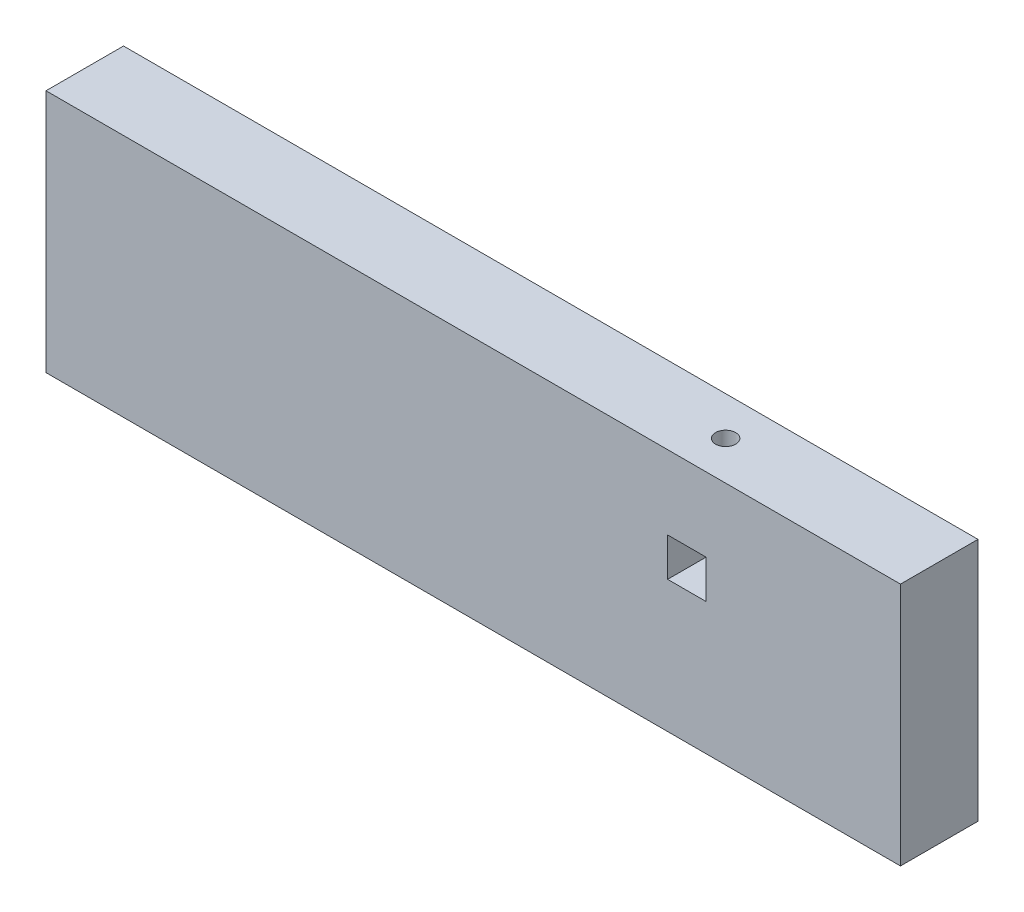
ISO-10303-21;
HEADER;
FILE_DESCRIPTION(('STEP AP214'),'2;1');
FILE_NAME('part.step','',(''),(''),'','','');
FILE_SCHEMA(('AUTOMOTIVE_DESIGN { 1 0 10303 214 1 1 1 1 }'));
ENDSEC;
DATA;
#1=APPLICATION_CONTEXT('core data for automotive mechanical design processes');
#2=APPLICATION_PROTOCOL_DEFINITION('international standard','automotive_design',2000,#1);
#3=PRODUCT_CONTEXT('',#1,'mechanical');
#4=PRODUCT('Part','Part','',(#3));
#5=PRODUCT_RELATED_PRODUCT_CATEGORY('part','',(#4));
#6=PRODUCT_DEFINITION_FORMATION('','',#4);
#7=PRODUCT_DEFINITION_CONTEXT('part definition',#1,'design');
#8=PRODUCT_DEFINITION('design','',#6,#7);
#9=PRODUCT_DEFINITION_SHAPE('','',#8);
#10=(LENGTH_UNIT() NAMED_UNIT(*) SI_UNIT(.MILLI.,.METRE.));
#11=(NAMED_UNIT(*) PLANE_ANGLE_UNIT() SI_UNIT($,.RADIAN.));
#12=(NAMED_UNIT(*) SI_UNIT($,.STERADIAN.) SOLID_ANGLE_UNIT());
#13=UNCERTAINTY_MEASURE_WITH_UNIT(LENGTH_MEASURE(1.E-05),#10,'distance_accuracy_value','');
#14=(GEOMETRIC_REPRESENTATION_CONTEXT(3) GLOBAL_UNCERTAINTY_ASSIGNED_CONTEXT((#13)) GLOBAL_UNIT_ASSIGNED_CONTEXT((#10,
#11,#12)) REPRESENTATION_CONTEXT('',''));
#15=CARTESIAN_POINT('',(0.,0.,0.));
#16=DIRECTION('',(0.,0.,1.));
#17=DIRECTION('',(1.,0.,0.));
#18=AXIS2_PLACEMENT_3D('',#15,#16,#17);
#19=CARTESIAN_POINT('',(0.,0.,12.7));
#20=DIRECTION('',(0.,0.,1.));
#21=DIRECTION('',(1.,0.,0.));
#22=AXIS2_PLACEMENT_3D('',#19,#20,#21);
#23=PLANE('',#22);
#24=DIRECTION('',(0.,-1.,0.));
#25=VECTOR('',#24,1.);
#26=CARTESIAN_POINT('',(-70.,40.,12.7));
#27=LINE('',#26,#25);
#28=CARTESIAN_POINT('',(-70.,40.,12.7));
#29=VERTEX_POINT('',#28);
#30=CARTESIAN_POINT('',(-70.,0.,12.7));
#31=VERTEX_POINT('',#30);
#32=EDGE_CURVE('E169',#29,#31,#27,.T.);
#33=ORIENTED_EDGE('',*,*,#32,.T.);
#34=DIRECTION('',(1.,0.,0.));
#35=VECTOR('',#34,1.);
#36=CARTESIAN_POINT('',(-70.,0.,12.7));
#37=LINE('',#36,#35);
#38=CARTESIAN_POINT('',(70.,0.,12.7));
#39=VERTEX_POINT('',#38);
#40=EDGE_CURVE('E172',#31,#39,#37,.T.);
#41=ORIENTED_EDGE('',*,*,#40,.T.);
#42=DIRECTION('',(0.,1.,0.));
#43=VECTOR('',#42,1.);
#44=CARTESIAN_POINT('',(70.,40.,12.7));
#45=LINE('',#44,#43);
#46=CARTESIAN_POINT('',(70.,40.,12.7));
#47=VERTEX_POINT('',#46);
#48=EDGE_CURVE('E175',#39,#47,#45,.T.);
#49=ORIENTED_EDGE('',*,*,#48,.T.);
#50=DIRECTION('',(-1.,0.,0.));
#51=VECTOR('',#50,1.);
#52=CARTESIAN_POINT('',(-70.,40.,12.7));
#53=LINE('',#52,#51);
#54=EDGE_CURVE('E177',#47,#29,#53,.T.);
#55=ORIENTED_EDGE('',*,*,#54,.T.);
#56=EDGE_LOOP('',(#33,#41,#49,#55));
#57=FACE_BOUND('',#56,.T.);
#58=DIRECTION('',(1.,0.,0.));
#59=VECTOR('',#58,1.);
#60=CARTESIAN_POINT('',(31.85,21.6,12.7));
#61=LINE('',#60,#59);
#62=CARTESIAN_POINT('',(31.85,21.6,12.7));
#63=VERTEX_POINT('',#62);
#64=CARTESIAN_POINT('',(38.15,21.6,12.7));
#65=VERTEX_POINT('',#64);
#66=EDGE_CURVE('E145',#63,#65,#61,.T.);
#67=ORIENTED_EDGE('',*,*,#66,.F.);
#68=DIRECTION('',(0.,-1.,0.));
#69=VECTOR('',#68,1.);
#70=CARTESIAN_POINT('',(31.85,27.9,12.7));
#71=LINE('',#70,#69);
#72=CARTESIAN_POINT('',(31.85,27.9,12.7));
#73=VERTEX_POINT('',#72);
#74=EDGE_CURVE('E143',#73,#63,#71,.T.);
#75=ORIENTED_EDGE('',*,*,#74,.F.);
#76=DIRECTION('',(-1.,0.,0.));
#77=VECTOR('',#76,1.);
#78=CARTESIAN_POINT('',(31.85,27.9,12.7));
#79=LINE('',#78,#77);
#80=CARTESIAN_POINT('',(38.15,27.9,12.7));
#81=VERTEX_POINT('',#80);
#82=EDGE_CURVE('E150',#81,#73,#79,.T.);
#83=ORIENTED_EDGE('',*,*,#82,.F.);
#84=DIRECTION('',(0.,1.,0.));
#85=VECTOR('',#84,1.);
#86=CARTESIAN_POINT('',(38.15,27.9,12.7));
#87=LINE('',#86,#85);
#88=EDGE_CURVE('E148',#65,#81,#87,.T.);
#89=ORIENTED_EDGE('',*,*,#88,.F.);
#90=EDGE_LOOP('',(#67,#75,#83,#89));
#91=FACE_BOUND('',#90,.T.);
#92=ADVANCED_FACE('F36',(#57,#91),#23,.T.);
#93=CARTESIAN_POINT('',(0.,0.,0.));
#94=DIRECTION('',(0.,0.,1.));
#95=DIRECTION('',(1.,0.,0.));
#96=AXIS2_PLACEMENT_3D('',#93,#94,#95);
#97=PLANE('',#96);
#98=DIRECTION('',(0.,-1.,0.));
#99=VECTOR('',#98,1.);
#100=CARTESIAN_POINT('',(-70.,40.,0.));
#101=LINE('',#100,#99);
#102=CARTESIAN_POINT('',(-70.,40.,0.));
#103=VERTEX_POINT('',#102);
#104=CARTESIAN_POINT('',(-70.,0.,0.));
#105=VERTEX_POINT('',#104);
#106=EDGE_CURVE('E168',#103,#105,#101,.T.);
#107=ORIENTED_EDGE('',*,*,#106,.F.);
#108=DIRECTION('',(-1.,0.,0.));
#109=VECTOR('',#108,1.);
#110=CARTESIAN_POINT('',(-70.,40.,0.));
#111=LINE('',#110,#109);
#112=CARTESIAN_POINT('',(70.,40.,0.));
#113=VERTEX_POINT('',#112);
#114=EDGE_CURVE('E173',#113,#103,#111,.T.);
#115=ORIENTED_EDGE('',*,*,#114,.F.);
#116=DIRECTION('',(0.,1.,0.));
#117=VECTOR('',#116,1.);
#118=CARTESIAN_POINT('',(70.,40.,0.));
#119=LINE('',#118,#117);
#120=CARTESIAN_POINT('',(70.,0.,0.));
#121=VERTEX_POINT('',#120);
#122=EDGE_CURVE('E184',#121,#113,#119,.T.);
#123=ORIENTED_EDGE('',*,*,#122,.F.);
#124=DIRECTION('',(1.,0.,0.));
#125=VECTOR('',#124,1.);
#126=CARTESIAN_POINT('',(-70.,0.,0.));
#127=LINE('',#126,#125);
#128=EDGE_CURVE('E182',#105,#121,#127,.T.);
#129=ORIENTED_EDGE('',*,*,#128,.F.);
#130=EDGE_LOOP('',(#107,#115,#123,#129));
#131=FACE_BOUND('',#130,.T.);
#132=DIRECTION('',(0.,-1.,0.));
#133=VECTOR('',#132,1.);
#134=CARTESIAN_POINT('',(31.85,27.9,0.));
#135=LINE('',#134,#133);
#136=CARTESIAN_POINT('',(31.85,27.9,0.));
#137=VERTEX_POINT('',#136);
#138=CARTESIAN_POINT('',(31.85,21.6,0.));
#139=VERTEX_POINT('',#138);
#140=EDGE_CURVE('E59',#137,#139,#135,.T.);
#141=ORIENTED_EDGE('',*,*,#140,.T.);
#142=DIRECTION('',(1.,0.,0.));
#143=VECTOR('',#142,1.);
#144=CARTESIAN_POINT('',(31.85,21.6,0.));
#145=LINE('',#144,#143);
#146=CARTESIAN_POINT('',(38.15,21.6,0.));
#147=VERTEX_POINT('',#146);
#148=EDGE_CURVE('E154',#139,#147,#145,.T.);
#149=ORIENTED_EDGE('',*,*,#148,.T.);
#150=DIRECTION('',(0.,1.,0.));
#151=VECTOR('',#150,1.);
#152=CARTESIAN_POINT('',(38.15,27.9,0.));
#153=LINE('',#152,#151);
#154=CARTESIAN_POINT('',(38.15,27.9,0.));
#155=VERTEX_POINT('',#154);
#156=EDGE_CURVE('E157',#147,#155,#153,.T.);
#157=ORIENTED_EDGE('',*,*,#156,.T.);
#158=DIRECTION('',(-1.,0.,0.));
#159=VECTOR('',#158,1.);
#160=CARTESIAN_POINT('',(31.85,27.9,0.));
#161=LINE('',#160,#159);
#162=EDGE_CURVE('E146',#155,#137,#161,.T.);
#163=ORIENTED_EDGE('',*,*,#162,.T.);
#164=EDGE_LOOP('',(#141,#149,#157,#163));
#165=FACE_BOUND('',#164,.T.);
#166=ADVANCED_FACE('F202',(#131,#165),#97,.F.);
#167=CARTESIAN_POINT('',(-70.,40.,12.7));
#168=DIRECTION('',(1.,0.,0.));
#169=DIRECTION('',(0.,0.,-1.));
#170=AXIS2_PLACEMENT_3D('',#167,#168,#169);
#171=PLANE('',#170);
#172=ORIENTED_EDGE('',*,*,#106,.T.);
#173=DIRECTION('',(0.,0.,-1.));
#174=VECTOR('',#173,1.);
#175=CARTESIAN_POINT('',(-70.,0.,12.7));
#176=LINE('',#175,#174);
#177=EDGE_CURVE('E11',#31,#105,#176,.T.);
#178=ORIENTED_EDGE('',*,*,#177,.F.);
#179=ORIENTED_EDGE('',*,*,#32,.F.);
#180=DIRECTION('',(0.,0.,-1.));
#181=VECTOR('',#180,1.);
#182=CARTESIAN_POINT('',(-70.,40.,12.7));
#183=LINE('',#182,#181);
#184=EDGE_CURVE('E179',#29,#103,#183,.T.);
#185=ORIENTED_EDGE('',*,*,#184,.T.);
#186=EDGE_LOOP('',(#172,#178,#179,#185));
#187=FACE_BOUND('',#186,.T.);
#188=ADVANCED_FACE('F38',(#187),#171,.F.);
#189=CARTESIAN_POINT('',(-70.,0.,12.7));
#190=DIRECTION('',(0.,1.,0.));
#191=DIRECTION('',(0.,0.,1.));
#192=AXIS2_PLACEMENT_3D('',#189,#190,#191);
#193=PLANE('',#192);
#194=CARTESIAN_POINT('',(-60.,0.,6.35));
#195=DIRECTION('',(0.,-1.,0.));
#196=DIRECTION('',(0.,0.,-1.));
#197=AXIS2_PLACEMENT_3D('',#194,#195,#196);
#198=CIRCLE('',#197,2.09999999999999);
#199=CARTESIAN_POINT('',(-60.,0.,4.25000000000001));
#200=VERTEX_POINT('',#199);
#201=EDGE_CURVE('E121',#200,#200,#198,.T.);
#202=ORIENTED_EDGE('',*,*,#201,.F.);
#203=EDGE_LOOP('',(#202));
#204=FACE_BOUND('',#203,.T.);
#205=CARTESIAN_POINT('',(0.,0.,6.35));
#206=DIRECTION('',(0.,-1.,0.));
#207=DIRECTION('',(0.,0.,-1.));
#208=AXIS2_PLACEMENT_3D('',#205,#206,#207);
#209=CIRCLE('',#208,2.09999999999999);
#210=CARTESIAN_POINT('',(0.,0.,4.25000000000001));
#211=VERTEX_POINT('',#210);
#212=EDGE_CURVE('E120',#211,#211,#209,.T.);
#213=ORIENTED_EDGE('',*,*,#212,.F.);
#214=EDGE_LOOP('',(#213));
#215=FACE_BOUND('',#214,.T.);
#216=CARTESIAN_POINT('',(60.,0.,6.35));
#217=DIRECTION('',(0.,-1.,0.));
#218=DIRECTION('',(0.,0.,-1.));
#219=AXIS2_PLACEMENT_3D('',#216,#217,#218);
#220=CIRCLE('',#219,2.09999999999999);
#221=CARTESIAN_POINT('',(60.,0.,4.25000000000001));
#222=VERTEX_POINT('',#221);
#223=EDGE_CURVE('E131',#222,#222,#220,.T.);
#224=ORIENTED_EDGE('',*,*,#223,.F.);
#225=EDGE_LOOP('',(#224));
#226=FACE_BOUND('',#225,.T.);
#227=ORIENTED_EDGE('',*,*,#128,.T.);
#228=DIRECTION('',(0.,0.,-1.));
#229=VECTOR('',#228,1.);
#230=CARTESIAN_POINT('',(70.,0.,12.7));
#231=LINE('',#230,#229);
#232=EDGE_CURVE('E44',#39,#121,#231,.T.);
#233=ORIENTED_EDGE('',*,*,#232,.F.);
#234=ORIENTED_EDGE('',*,*,#40,.F.);
#235=ORIENTED_EDGE('',*,*,#177,.T.);
#236=EDGE_LOOP('',(#227,#233,#234,#235));
#237=FACE_BOUND('',#236,.T.);
#238=ADVANCED_FACE('F213',(#204,#215,#226,#237),#193,.F.);
#239=CARTESIAN_POINT('',(70.,40.,12.7));
#240=DIRECTION('',(-1.,0.,0.));
#241=DIRECTION('',(0.,0.,1.));
#242=AXIS2_PLACEMENT_3D('',#239,#240,#241);
#243=PLANE('',#242);
#244=ORIENTED_EDGE('',*,*,#122,.T.);
#245=DIRECTION('',(0.,0.,-1.));
#246=VECTOR('',#245,1.);
#247=CARTESIAN_POINT('',(70.,40.,12.7));
#248=LINE('',#247,#246);
#249=EDGE_CURVE('E189',#47,#113,#248,.T.);
#250=ORIENTED_EDGE('',*,*,#249,.F.);
#251=ORIENTED_EDGE('',*,*,#48,.F.);
#252=ORIENTED_EDGE('',*,*,#232,.T.);
#253=EDGE_LOOP('',(#244,#250,#251,#252));
#254=FACE_BOUND('',#253,.T.);
#255=ADVANCED_FACE('F196',(#254),#243,.F.);
#256=CARTESIAN_POINT('',(-70.,40.,12.7));
#257=DIRECTION('',(0.,-1.,0.));
#258=DIRECTION('',(0.,0.,-1.));
#259=AXIS2_PLACEMENT_3D('',#256,#257,#258);
#260=PLANE('',#259);
#261=CARTESIAN_POINT('',(35.,40.,6.35));
#262=DIRECTION('',(0.,1.,0.));
#263=DIRECTION('',(0.,0.,1.));
#264=AXIS2_PLACEMENT_3D('',#261,#262,#263);
#265=CIRCLE('',#264,1.65);
#266=CARTESIAN_POINT('',(35.,40.,8.));
#267=VERTEX_POINT('',#266);
#268=EDGE_CURVE('E137',#267,#267,#265,.T.);
#269=ORIENTED_EDGE('',*,*,#268,.F.);
#270=EDGE_LOOP('',(#269));
#271=FACE_BOUND('',#270,.T.);
#272=ORIENTED_EDGE('',*,*,#114,.T.);
#273=ORIENTED_EDGE('',*,*,#184,.F.);
#274=ORIENTED_EDGE('',*,*,#54,.F.);
#275=ORIENTED_EDGE('',*,*,#249,.T.);
#276=EDGE_LOOP('',(#272,#273,#274,#275));
#277=FACE_BOUND('',#276,.T.);
#278=ADVANCED_FACE('F206',(#271,#277),#260,.F.);
#279=CARTESIAN_POINT('',(31.85,27.9,12.7));
#280=DIRECTION('',(1.,0.,0.));
#281=DIRECTION('',(0.,0.,-1.));
#282=AXIS2_PLACEMENT_3D('',#279,#280,#281);
#283=PLANE('',#282);
#284=ORIENTED_EDGE('',*,*,#140,.F.);
#285=DIRECTION('',(0.,0.,-1.));
#286=VECTOR('',#285,1.);
#287=CARTESIAN_POINT('',(31.85,27.9,12.7));
#288=LINE('',#287,#286);
#289=EDGE_CURVE('E152',#73,#137,#288,.T.);
#290=ORIENTED_EDGE('',*,*,#289,.F.);
#291=ORIENTED_EDGE('',*,*,#74,.T.);
#292=DIRECTION('',(0.,0.,-1.));
#293=VECTOR('',#292,1.);
#294=CARTESIAN_POINT('',(31.85,21.6,12.7));
#295=LINE('',#294,#293);
#296=EDGE_CURVE('E166',#63,#139,#295,.T.);
#297=ORIENTED_EDGE('',*,*,#296,.T.);
#298=EDGE_LOOP('',(#284,#290,#291,#297));
#299=FACE_BOUND('',#298,.T.);
#300=ADVANCED_FACE('F230',(#299),#283,.T.);
#301=CARTESIAN_POINT('',(31.85,21.6,12.7));
#302=DIRECTION('',(0.,1.,0.));
#303=DIRECTION('',(-1.,0.,0.));
#304=AXIS2_PLACEMENT_3D('',#301,#302,#303);
#305=PLANE('',#304);
#306=ORIENTED_EDGE('',*,*,#148,.F.);
#307=ORIENTED_EDGE('',*,*,#296,.F.);
#308=ORIENTED_EDGE('',*,*,#66,.T.);
#309=DIRECTION('',(0.,0.,-1.));
#310=VECTOR('',#309,1.);
#311=CARTESIAN_POINT('',(38.15,21.6,12.7));
#312=LINE('',#311,#310);
#313=EDGE_CURVE('E164',#65,#147,#312,.T.);
#314=ORIENTED_EDGE('',*,*,#313,.T.);
#315=EDGE_LOOP('',(#306,#307,#308,#314));
#316=FACE_BOUND('',#315,.T.);
#317=ADVANCED_FACE('F238',(#316),#305,.T.);
#318=CARTESIAN_POINT('',(38.15,27.9,12.7));
#319=DIRECTION('',(-1.,0.,0.));
#320=DIRECTION('',(0.,0.,1.));
#321=AXIS2_PLACEMENT_3D('',#318,#319,#320);
#322=PLANE('',#321);
#323=ORIENTED_EDGE('',*,*,#156,.F.);
#324=ORIENTED_EDGE('',*,*,#313,.F.);
#325=ORIENTED_EDGE('',*,*,#88,.T.);
#326=DIRECTION('',(0.,0.,-1.));
#327=VECTOR('',#326,1.);
#328=CARTESIAN_POINT('',(38.15,27.9,12.7));
#329=LINE('',#328,#327);
#330=EDGE_CURVE('E51',#81,#155,#329,.T.);
#331=ORIENTED_EDGE('',*,*,#330,.T.);
#332=EDGE_LOOP('',(#323,#324,#325,#331));
#333=FACE_BOUND('',#332,.T.);
#334=ADVANCED_FACE('F250',(#333),#322,.T.);
#335=CARTESIAN_POINT('',(31.85,27.9,12.7));
#336=DIRECTION('',(0.,-1.,0.));
#337=DIRECTION('',(0.,0.,-1.));
#338=AXIS2_PLACEMENT_3D('',#335,#336,#337);
#339=PLANE('',#338);
#340=CARTESIAN_POINT('',(35.,27.9,6.35));
#341=DIRECTION('',(0.,-1.,0.));
#342=DIRECTION('',(0.,0.,-1.));
#343=AXIS2_PLACEMENT_3D('',#340,#341,#342);
#344=CIRCLE('',#343,1.65);
#345=CARTESIAN_POINT('',(35.,27.9,4.7));
#346=VERTEX_POINT('',#345);
#347=EDGE_CURVE('E140',#346,#346,#344,.T.);
#348=ORIENTED_EDGE('',*,*,#347,.F.);
#349=EDGE_LOOP('',(#348));
#350=FACE_BOUND('',#349,.T.);
#351=ORIENTED_EDGE('',*,*,#162,.F.);
#352=ORIENTED_EDGE('',*,*,#330,.F.);
#353=ORIENTED_EDGE('',*,*,#82,.T.);
#354=ORIENTED_EDGE('',*,*,#289,.T.);
#355=EDGE_LOOP('',(#351,#352,#353,#354));
#356=FACE_BOUND('',#355,.T.);
#357=ADVANCED_FACE('F245',(#350,#356),#339,.T.);
#358=CARTESIAN_POINT('',(35.,40.,6.35));
#359=DIRECTION('',(0.,1.,0.));
#360=DIRECTION('',(0.,0.,1.));
#361=AXIS2_PLACEMENT_3D('',#358,#359,#360);
#362=CYLINDRICAL_SURFACE('',#361,1.65);
#363=ORIENTED_EDGE('',*,*,#268,.T.);
#364=EDGE_LOOP('',(#363));
#365=FACE_BOUND('',#364,.T.);
#366=ORIENTED_EDGE('',*,*,#347,.T.);
#367=EDGE_LOOP('',(#366));
#368=FACE_BOUND('',#367,.T.);
#369=ADVANCED_FACE('F241',(#365,#368),#362,.F.);
#370=CARTESIAN_POINT('',(60.,7.,6.35));
#371=DIRECTION('',(0.,-1.,0.));
#372=DIRECTION('',(0.,0.,-1.));
#373=AXIS2_PLACEMENT_3D('',#370,#371,#372);
#374=CONICAL_SURFACE('',#373,2.1,1.02974425867665);
#375=CARTESIAN_POINT('',(60.,8.26180729995788,6.35));
#376=VERTEX_POINT('',#375);
#377=VERTEX_LOOP('',#376);
#378=FACE_BOUND('',#377,.T.);
#379=CARTESIAN_POINT('',(60.,7.,6.35));
#380=DIRECTION('',(0.,-1.,0.));
#381=DIRECTION('',(0.,0.,-1.));
#382=AXIS2_PLACEMENT_3D('',#379,#380,#381);
#383=CIRCLE('',#382,2.1);
#384=CARTESIAN_POINT('',(60.,7.,4.25));
#385=VERTEX_POINT('',#384);
#386=EDGE_CURVE('E134',#385,#385,#383,.T.);
#387=ORIENTED_EDGE('',*,*,#386,.T.);
#388=EDGE_LOOP('',(#387));
#389=FACE_BOUND('',#388,.T.);
#390=ADVANCED_FACE('F244',(#378,#389),#374,.F.);
#391=CARTESIAN_POINT('',(60.,0.,6.35));
#392=DIRECTION('',(0.,-1.,0.));
#393=DIRECTION('',(0.,0.,-1.));
#394=AXIS2_PLACEMENT_3D('',#391,#392,#393);
#395=CYLINDRICAL_SURFACE('',#394,2.09999999999999);
#396=ORIENTED_EDGE('',*,*,#386,.F.);
#397=EDGE_LOOP('',(#396));
#398=FACE_BOUND('',#397,.T.);
#399=ORIENTED_EDGE('',*,*,#223,.T.);
#400=EDGE_LOOP('',(#399));
#401=FACE_BOUND('',#400,.T.);
#402=ADVANCED_FACE('F269',(#398,#401),#395,.F.);
#403=CARTESIAN_POINT('',(0.,7.,6.35));
#404=DIRECTION('',(0.,-1.,0.));
#405=DIRECTION('',(0.,0.,-1.));
#406=AXIS2_PLACEMENT_3D('',#403,#404,#405);
#407=CONICAL_SURFACE('',#406,2.1,1.02974425867665);
#408=CARTESIAN_POINT('',(0.,8.26180729995788,6.35));
#409=VERTEX_POINT('',#408);
#410=VERTEX_LOOP('',#409);
#411=FACE_BOUND('',#410,.T.);
#412=CARTESIAN_POINT('',(0.,7.,6.35));
#413=DIRECTION('',(0.,-1.,0.));
#414=DIRECTION('',(0.,0.,-1.));
#415=AXIS2_PLACEMENT_3D('',#412,#413,#414);
#416=CIRCLE('',#415,2.1);
#417=CARTESIAN_POINT('',(0.,7.,4.25));
#418=VERTEX_POINT('',#417);
#419=EDGE_CURVE('E124',#418,#418,#416,.T.);
#420=ORIENTED_EDGE('',*,*,#419,.T.);
#421=EDGE_LOOP('',(#420));
#422=FACE_BOUND('',#421,.T.);
#423=ADVANCED_FACE('F273',(#411,#422),#407,.F.);
#424=CARTESIAN_POINT('',(0.,0.,6.35));
#425=DIRECTION('',(0.,-1.,0.));
#426=DIRECTION('',(0.,0.,-1.));
#427=AXIS2_PLACEMENT_3D('',#424,#425,#426);
#428=CYLINDRICAL_SURFACE('',#427,2.09999999999999);
#429=ORIENTED_EDGE('',*,*,#419,.F.);
#430=EDGE_LOOP('',(#429));
#431=FACE_BOUND('',#430,.T.);
#432=ORIENTED_EDGE('',*,*,#212,.T.);
#433=EDGE_LOOP('',(#432));
#434=FACE_BOUND('',#433,.T.);
#435=ADVANCED_FACE('F114',(#431,#434),#428,.F.);
#436=CARTESIAN_POINT('',(-60.,7.,6.35));
#437=DIRECTION('',(0.,-1.,0.));
#438=DIRECTION('',(0.,0.,-1.));
#439=AXIS2_PLACEMENT_3D('',#436,#437,#438);
#440=CONICAL_SURFACE('',#439,2.1,1.02974425867665);
#441=CARTESIAN_POINT('',(-60.,8.26180729995788,6.35));
#442=VERTEX_POINT('',#441);
#443=VERTEX_LOOP('',#442);
#444=FACE_BOUND('',#443,.T.);
#445=CARTESIAN_POINT('',(-60.,7.,6.35));
#446=DIRECTION('',(0.,-1.,0.));
#447=DIRECTION('',(0.,0.,-1.));
#448=AXIS2_PLACEMENT_3D('',#445,#446,#447);
#449=CIRCLE('',#448,2.1);
#450=CARTESIAN_POINT('',(-60.,7.,4.25));
#451=VERTEX_POINT('',#450);
#452=EDGE_CURVE('E118',#451,#451,#449,.T.);
#453=ORIENTED_EDGE('',*,*,#452,.T.);
#454=EDGE_LOOP('',(#453));
#455=FACE_BOUND('',#454,.T.);
#456=ADVANCED_FACE('F110',(#444,#455),#440,.F.);
#457=CARTESIAN_POINT('',(-60.,0.,6.35));
#458=DIRECTION('',(0.,-1.,0.));
#459=DIRECTION('',(0.,0.,-1.));
#460=AXIS2_PLACEMENT_3D('',#457,#458,#459);
#461=CYLINDRICAL_SURFACE('',#460,2.09999999999999);
#462=ORIENTED_EDGE('',*,*,#452,.F.);
#463=EDGE_LOOP('',(#462));
#464=FACE_BOUND('',#463,.T.);
#465=ORIENTED_EDGE('',*,*,#201,.T.);
#466=EDGE_LOOP('',(#465));
#467=FACE_BOUND('',#466,.T.);
#468=ADVANCED_FACE('F113',(#464,#467),#461,.F.);
#469=CLOSED_SHELL('',(#92,#166,#188,#238,#255,#278,#300,#317,#334,#357,#369,#390,#402,#423,#435,
#456,#468));
#470=MANIFOLD_SOLID_BREP('B2',#469);
#471=ADVANCED_BREP_SHAPE_REPRESENTATION('',(#18,#470),#14);
#472=SHAPE_DEFINITION_REPRESENTATION(#9,#471);
ENDSEC;
END-ISO-10303-21;
